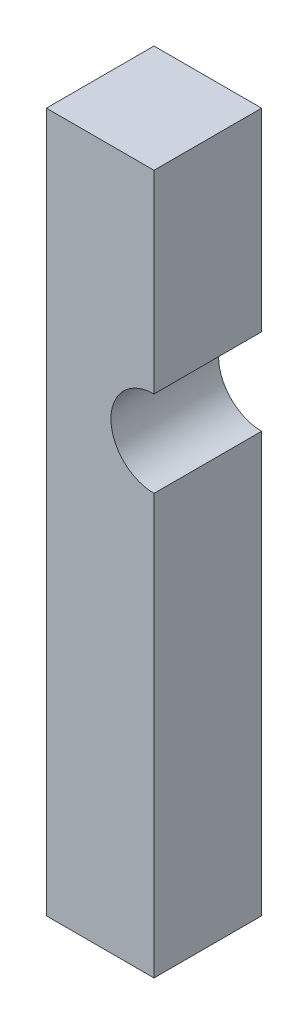
ISO-10303-21;
HEADER;
FILE_DESCRIPTION(('STEP AP214'),'2;1');
FILE_NAME('part.step','',(''),(''),'','','');
FILE_SCHEMA(('AUTOMOTIVE_DESIGN { 1 0 10303 214 1 1 1 1 }'));
ENDSEC;
DATA;
#1=APPLICATION_CONTEXT('core data for automotive mechanical design processes');
#2=APPLICATION_PROTOCOL_DEFINITION('international standard','automotive_design',2000,#1);
#3=PRODUCT_CONTEXT('',#1,'mechanical');
#4=PRODUCT('Part','Part','',(#3));
#5=PRODUCT_RELATED_PRODUCT_CATEGORY('part','',(#4));
#6=PRODUCT_DEFINITION_FORMATION('','',#4);
#7=PRODUCT_DEFINITION_CONTEXT('part definition',#1,'design');
#8=PRODUCT_DEFINITION('design','',#6,#7);
#9=PRODUCT_DEFINITION_SHAPE('','',#8);
#10=(LENGTH_UNIT() NAMED_UNIT(*) SI_UNIT(.MILLI.,.METRE.));
#11=(NAMED_UNIT(*) PLANE_ANGLE_UNIT() SI_UNIT($,.RADIAN.));
#12=(NAMED_UNIT(*) SI_UNIT($,.STERADIAN.) SOLID_ANGLE_UNIT());
#13=UNCERTAINTY_MEASURE_WITH_UNIT(LENGTH_MEASURE(1.E-05),#10,'distance_accuracy_value','');
#14=(GEOMETRIC_REPRESENTATION_CONTEXT(3) GLOBAL_UNCERTAINTY_ASSIGNED_CONTEXT((#13)) GLOBAL_UNIT_ASSIGNED_CONTEXT((#10,
#11,#12)) REPRESENTATION_CONTEXT('',''));
#15=CARTESIAN_POINT('',(0.,0.,0.));
#16=DIRECTION('',(0.,0.,1.));
#17=DIRECTION('',(1.,0.,0.));
#18=AXIS2_PLACEMENT_3D('',#15,#16,#17);
#19=CARTESIAN_POINT('',(2.5,16.25,2.5));
#20=DIRECTION('',(-1.,0.,0.));
#21=DIRECTION('',(0.,0.,1.));
#22=AXIS2_PLACEMENT_3D('',#19,#20,#21);
#23=PLANE('',#22);
#24=DIRECTION('',(0.,-1.,0.));
#25=VECTOR('',#24,1.);
#26=CARTESIAN_POINT('',(2.5,16.25,-2.5));
#27=LINE('',#26,#25);
#28=CARTESIAN_POINT('',(2.5,3.25,-2.5));
#29=VERTEX_POINT('',#28);
#30=CARTESIAN_POINT('',(2.5,-16.25,-2.5));
#31=VERTEX_POINT('',#30);
#32=EDGE_CURVE('E43',#29,#31,#27,.T.);
#33=ORIENTED_EDGE('',*,*,#32,.F.);
#34=DIRECTION('',(0.,0.,1.));
#35=VECTOR('',#34,1.);
#36=CARTESIAN_POINT('',(2.5,3.25,-2.5));
#37=LINE('',#36,#35);
#38=CARTESIAN_POINT('',(2.5,3.25,2.5));
#39=VERTEX_POINT('',#38);
#40=EDGE_CURVE('E98',#29,#39,#37,.T.);
#41=ORIENTED_EDGE('',*,*,#40,.T.);
#42=DIRECTION('',(0.,-1.,0.));
#43=VECTOR('',#42,1.);
#44=CARTESIAN_POINT('',(2.5,16.25,2.5));
#45=LINE('',#44,#43);
#46=CARTESIAN_POINT('',(2.5,-16.25,2.5));
#47=VERTEX_POINT('',#46);
#48=EDGE_CURVE('E81',#39,#47,#45,.T.);
#49=ORIENTED_EDGE('',*,*,#48,.T.);
#50=DIRECTION('',(0.,0.,-1.));
#51=VECTOR('',#50,1.);
#52=CARTESIAN_POINT('',(2.5,-16.25,2.5));
#53=LINE('',#52,#51);
#54=EDGE_CURVE('E124',#47,#31,#53,.T.);
#55=ORIENTED_EDGE('',*,*,#54,.T.);
#56=EDGE_LOOP('',(#33,#41,#49,#55));
#57=FACE_BOUND('',#56,.T.);
#58=ADVANCED_FACE('F35',(#57),#23,.F.);
#59=CARTESIAN_POINT('',(2.5,16.25,2.5));
#60=VERTEX_POINT('',#59);
#61=CARTESIAN_POINT('',(2.5,7.25,2.5));
#62=VERTEX_POINT('',#61);
#63=EDGE_CURVE('E106',#60,#62,#45,.T.);
#64=ORIENTED_EDGE('',*,*,#63,.T.);
#65=DIRECTION('',(0.,0.,1.));
#66=VECTOR('',#65,1.);
#67=CARTESIAN_POINT('',(2.5,7.25,-2.5));
#68=LINE('',#67,#66);
#69=CARTESIAN_POINT('',(2.5,7.25,-2.5));
#70=VERTEX_POINT('',#69);
#71=EDGE_CURVE('E50',#62,#70,#68,.F.);
#72=ORIENTED_EDGE('',*,*,#71,.T.);
#73=CARTESIAN_POINT('',(2.5,16.25,-2.5));
#74=VERTEX_POINT('',#73);
#75=EDGE_CURVE('E11',#74,#70,#27,.T.);
#76=ORIENTED_EDGE('',*,*,#75,.F.);
#77=DIRECTION('',(0.,0.,-1.));
#78=VECTOR('',#77,1.);
#79=CARTESIAN_POINT('',(2.5,16.25,2.5));
#80=LINE('',#79,#78);
#81=EDGE_CURVE('E137',#60,#74,#80,.T.);
#82=ORIENTED_EDGE('',*,*,#81,.F.);
#83=EDGE_LOOP('',(#64,#72,#76,#82));
#84=FACE_BOUND('',#83,.T.);
#85=ADVANCED_FACE('F37',(#84),#23,.F.);
#86=CARTESIAN_POINT('',(-2.5,16.25,-2.5));
#87=DIRECTION('',(0.,0.,1.));
#88=DIRECTION('',(1.,0.,0.));
#89=AXIS2_PLACEMENT_3D('',#86,#87,#88);
#90=PLANE('',#89);
#91=ORIENTED_EDGE('',*,*,#75,.T.);
#92=CARTESIAN_POINT('',(2.5,5.25,-2.5));
#93=DIRECTION('',(0.,0.,1.));
#94=DIRECTION('',(1.,0.,0.));
#95=AXIS2_PLACEMENT_3D('',#92,#93,#94);
#96=CIRCLE('',#95,2.);
#97=EDGE_CURVE('E96',#70,#29,#96,.T.);
#98=ORIENTED_EDGE('',*,*,#97,.T.);
#99=ORIENTED_EDGE('',*,*,#32,.T.);
#100=DIRECTION('',(-1.,0.,0.));
#101=VECTOR('',#100,1.);
#102=CARTESIAN_POINT('',(-2.5,-16.25,-2.5));
#103=LINE('',#102,#101);
#104=CARTESIAN_POINT('',(-2.5,-16.25,-2.5));
#105=VERTEX_POINT('',#104);
#106=EDGE_CURVE('E140',#31,#105,#103,.T.);
#107=ORIENTED_EDGE('',*,*,#106,.T.);
#108=DIRECTION('',(0.,-1.,0.));
#109=VECTOR('',#108,1.);
#110=CARTESIAN_POINT('',(-2.5,16.25,-2.5));
#111=LINE('',#110,#109);
#112=CARTESIAN_POINT('',(-2.5,16.25,-2.5));
#113=VERTEX_POINT('',#112);
#114=EDGE_CURVE('E126',#113,#105,#111,.T.);
#115=ORIENTED_EDGE('',*,*,#114,.F.);
#116=DIRECTION('',(-1.,0.,0.));
#117=VECTOR('',#116,1.);
#118=CARTESIAN_POINT('',(-2.5,16.25,-2.5));
#119=LINE('',#118,#117);
#120=EDGE_CURVE('E88',#74,#113,#119,.T.);
#121=ORIENTED_EDGE('',*,*,#120,.F.);
#122=EDGE_LOOP('',(#91,#98,#99,#107,#115,#121));
#123=FACE_BOUND('',#122,.T.);
#124=ADVANCED_FACE('F108',(#123),#90,.F.);
#125=CARTESIAN_POINT('',(-2.5,16.25,2.5));
#126=DIRECTION('',(1.,0.,0.));
#127=DIRECTION('',(0.,0.,-1.));
#128=AXIS2_PLACEMENT_3D('',#125,#126,#127);
#129=PLANE('',#128);
#130=DIRECTION('',(0.,0.,1.));
#131=VECTOR('',#130,1.);
#132=CARTESIAN_POINT('',(-2.5,-16.25,2.5));
#133=LINE('',#132,#131);
#134=CARTESIAN_POINT('',(-2.5,-16.25,2.5));
#135=VERTEX_POINT('',#134);
#136=EDGE_CURVE('E138',#105,#135,#133,.T.);
#137=ORIENTED_EDGE('',*,*,#136,.T.);
#138=DIRECTION('',(0.,-1.,0.));
#139=VECTOR('',#138,1.);
#140=CARTESIAN_POINT('',(-2.5,16.25,2.5));
#141=LINE('',#140,#139);
#142=CARTESIAN_POINT('',(-2.5,16.25,2.5));
#143=VERTEX_POINT('',#142);
#144=EDGE_CURVE('E128',#143,#135,#141,.T.);
#145=ORIENTED_EDGE('',*,*,#144,.F.);
#146=DIRECTION('',(0.,0.,1.));
#147=VECTOR('',#146,1.);
#148=CARTESIAN_POINT('',(-2.5,16.25,2.5));
#149=LINE('',#148,#147);
#150=EDGE_CURVE('E144',#113,#143,#149,.T.);
#151=ORIENTED_EDGE('',*,*,#150,.F.);
#152=ORIENTED_EDGE('',*,*,#114,.T.);
#153=EDGE_LOOP('',(#137,#145,#151,#152));
#154=FACE_BOUND('',#153,.T.);
#155=ADVANCED_FACE('F110',(#154),#129,.F.);
#156=CARTESIAN_POINT('',(-2.5,16.25,2.5));
#157=DIRECTION('',(0.,0.,-1.));
#158=DIRECTION('',(-1.,0.,0.));
#159=AXIS2_PLACEMENT_3D('',#156,#157,#158);
#160=PLANE('',#159);
#161=ORIENTED_EDGE('',*,*,#48,.F.);
#162=CARTESIAN_POINT('',(2.5,5.25,2.5));
#163=DIRECTION('',(0.,0.,1.));
#164=DIRECTION('',(1.,0.,0.));
#165=AXIS2_PLACEMENT_3D('',#162,#163,#164);
#166=CIRCLE('',#165,2.);
#167=EDGE_CURVE('E100',#62,#39,#166,.T.);
#168=ORIENTED_EDGE('',*,*,#167,.F.);
#169=ORIENTED_EDGE('',*,*,#63,.F.);
#170=DIRECTION('',(1.,0.,0.));
#171=VECTOR('',#170,1.);
#172=CARTESIAN_POINT('',(-2.5,16.25,2.5));
#173=LINE('',#172,#171);
#174=EDGE_CURVE('E59',#143,#60,#173,.T.);
#175=ORIENTED_EDGE('',*,*,#174,.F.);
#176=ORIENTED_EDGE('',*,*,#144,.T.);
#177=DIRECTION('',(1.,0.,0.));
#178=VECTOR('',#177,1.);
#179=CARTESIAN_POINT('',(-2.5,-16.25,2.5));
#180=LINE('',#179,#178);
#181=EDGE_CURVE('E135',#135,#47,#180,.T.);
#182=ORIENTED_EDGE('',*,*,#181,.T.);
#183=EDGE_LOOP('',(#161,#168,#169,#175,#176,#182));
#184=FACE_BOUND('',#183,.T.);
#185=ADVANCED_FACE('F116',(#184),#160,.F.);
#186=CARTESIAN_POINT('',(0.,16.25,0.));
#187=DIRECTION('',(0.,-1.,0.));
#188=DIRECTION('',(0.,0.,-1.));
#189=AXIS2_PLACEMENT_3D('',#186,#187,#188);
#190=PLANE('',#189);
#191=ORIENTED_EDGE('',*,*,#81,.T.);
#192=ORIENTED_EDGE('',*,*,#120,.T.);
#193=ORIENTED_EDGE('',*,*,#150,.T.);
#194=ORIENTED_EDGE('',*,*,#174,.T.);
#195=EDGE_LOOP('',(#191,#192,#193,#194));
#196=FACE_BOUND('',#195,.T.);
#197=ADVANCED_FACE('F154',(#196),#190,.F.);
#198=CARTESIAN_POINT('',(0.,-16.25,0.));
#199=DIRECTION('',(0.,-1.,0.));
#200=DIRECTION('',(0.,0.,-1.));
#201=AXIS2_PLACEMENT_3D('',#198,#199,#200);
#202=PLANE('',#201);
#203=ORIENTED_EDGE('',*,*,#54,.F.);
#204=ORIENTED_EDGE('',*,*,#181,.F.);
#205=ORIENTED_EDGE('',*,*,#136,.F.);
#206=ORIENTED_EDGE('',*,*,#106,.F.);
#207=EDGE_LOOP('',(#203,#204,#205,#206));
#208=FACE_BOUND('',#207,.T.);
#209=ADVANCED_FACE('F153',(#208),#202,.T.);
#210=CARTESIAN_POINT('',(2.5,5.25,-2.5));
#211=DIRECTION('',(0.,0.,1.));
#212=DIRECTION('',(1.,0.,0.));
#213=AXIS2_PLACEMENT_3D('',#210,#211,#212);
#214=CYLINDRICAL_SURFACE('',#213,2.);
#215=ORIENTED_EDGE('',*,*,#97,.F.);
#216=ORIENTED_EDGE('',*,*,#71,.F.);
#217=ORIENTED_EDGE('',*,*,#167,.T.);
#218=ORIENTED_EDGE('',*,*,#40,.F.);
#219=EDGE_LOOP('',(#215,#216,#217,#218));
#220=FACE_BOUND('',#219,.T.);
#221=ADVANCED_FACE('F97',(#220),#214,.F.);
#222=CLOSED_SHELL('',(#58,#85,#124,#155,#185,#197,#209,#221));
#223=MANIFOLD_SOLID_BREP('B2',#222);
#224=ADVANCED_BREP_SHAPE_REPRESENTATION('',(#18,#223),#14);
#225=SHAPE_DEFINITION_REPRESENTATION(#9,#224);
ENDSEC;
END-ISO-10303-21;
